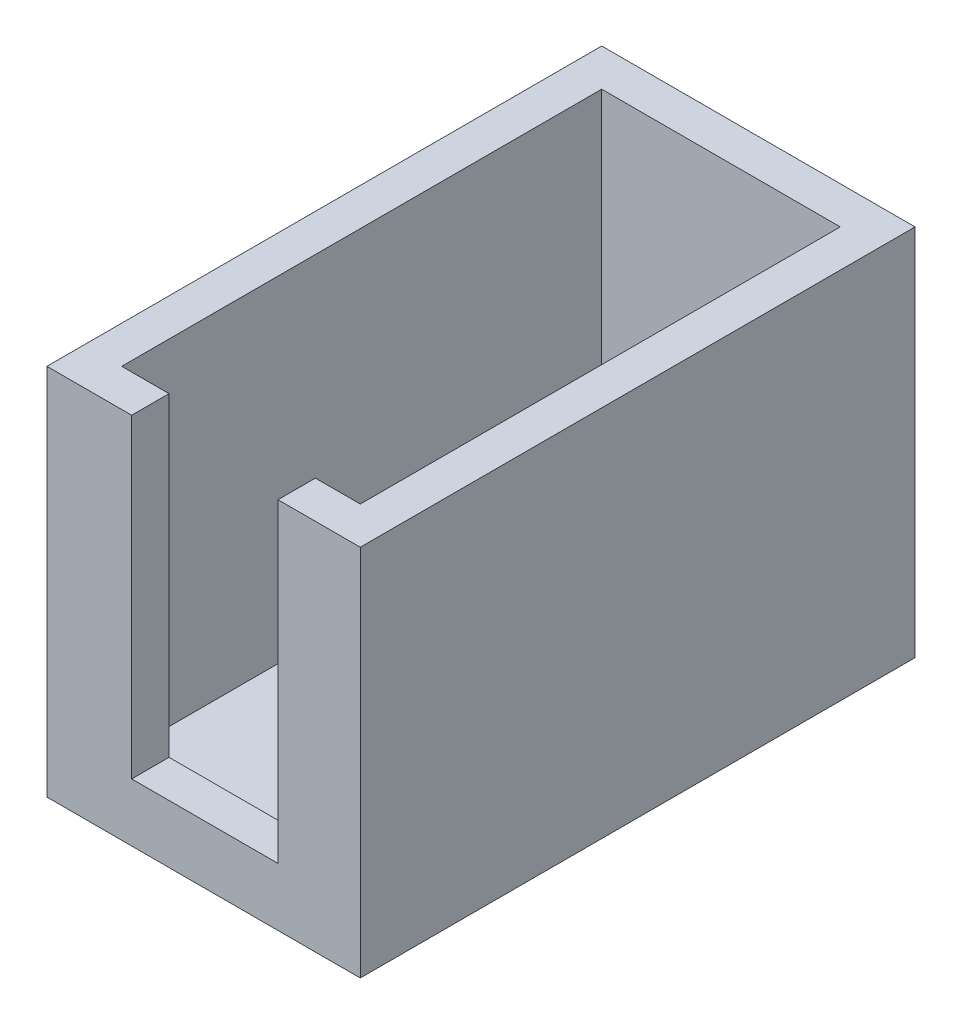
ISO-10303-21;
HEADER;
FILE_DESCRIPTION(('STEP AP214'),'2;1');
FILE_NAME('part.step','',(''),(''),'','','');
FILE_SCHEMA(('AUTOMOTIVE_DESIGN { 1 0 10303 214 1 1 1 1 }'));
ENDSEC;
DATA;
#1=APPLICATION_CONTEXT('core data for automotive mechanical design processes');
#2=APPLICATION_PROTOCOL_DEFINITION('international standard','automotive_design',2000,#1);
#3=PRODUCT_CONTEXT('',#1,'mechanical');
#4=PRODUCT('Part','Part','',(#3));
#5=PRODUCT_RELATED_PRODUCT_CATEGORY('part','',(#4));
#6=PRODUCT_DEFINITION_FORMATION('','',#4);
#7=PRODUCT_DEFINITION_CONTEXT('part definition',#1,'design');
#8=PRODUCT_DEFINITION('design','',#6,#7);
#9=PRODUCT_DEFINITION_SHAPE('','',#8);
#10=(LENGTH_UNIT() NAMED_UNIT(*) SI_UNIT(.MILLI.,.METRE.));
#11=(NAMED_UNIT(*) PLANE_ANGLE_UNIT() SI_UNIT($,.RADIAN.));
#12=(NAMED_UNIT(*) SI_UNIT($,.STERADIAN.) SOLID_ANGLE_UNIT());
#13=UNCERTAINTY_MEASURE_WITH_UNIT(LENGTH_MEASURE(1.E-05),#10,'distance_accuracy_value','');
#14=(GEOMETRIC_REPRESENTATION_CONTEXT(3) GLOBAL_UNCERTAINTY_ASSIGNED_CONTEXT((#13)) GLOBAL_UNIT_ASSIGNED_CONTEXT((#10,
#11,#12)) REPRESENTATION_CONTEXT('',''));
#15=CARTESIAN_POINT('',(0.,0.,0.));
#16=DIRECTION('',(0.,0.,1.));
#17=DIRECTION('',(1.,0.,0.));
#18=AXIS2_PLACEMENT_3D('',#15,#16,#17);
#19=CARTESIAN_POINT('',(0.,28.5,0.));
#20=DIRECTION('',(0.,-1.,0.));
#21=DIRECTION('',(0.,0.,-1.));
#22=AXIS2_PLACEMENT_3D('',#19,#20,#21);
#23=PLANE('',#22);
#24=DIRECTION('',(1.,0.,0.));
#25=VECTOR('',#24,1.);
#26=CARTESIAN_POINT('',(-10.127,28.5,20.377));
#27=LINE('',#26,#25);
#28=CARTESIAN_POINT('',(6.31565311853081,28.5,20.377));
#29=VERTEX_POINT('',#28);
#30=CARTESIAN_POINT('',(10.127,28.5,20.377));
#31=VERTEX_POINT('',#30);
#32=EDGE_CURVE('E187',#29,#31,#27,.T.);
#33=ORIENTED_EDGE('',*,*,#32,.F.);
#34=DIRECTION('',(0.,0.,1.));
#35=VECTOR('',#34,1.);
#36=CARTESIAN_POINT('',(6.31565311853081,28.5,-9.10991074063502));
#37=LINE('',#36,#35);
#38=CARTESIAN_POINT('',(6.31565311853081,28.5,23.552));
#39=VERTEX_POINT('',#38);
#40=EDGE_CURVE('E142',#29,#39,#37,.T.);
#41=ORIENTED_EDGE('',*,*,#40,.T.);
#42=DIRECTION('',(1.,0.,0.));
#43=VECTOR('',#42,1.);
#44=CARTESIAN_POINT('',(0.,28.5,23.552));
#45=LINE('',#44,#43);
#46=CARTESIAN_POINT('',(13.302,28.5,23.552));
#47=VERTEX_POINT('',#46);
#48=EDGE_CURVE('E248',#39,#47,#45,.T.);
#49=ORIENTED_EDGE('',*,*,#48,.T.);
#50=DIRECTION('',(0.,0.,-1.));
#51=VECTOR('',#50,1.);
#52=CARTESIAN_POINT('',(13.302,28.5,0.));
#53=LINE('',#52,#51);
#54=CARTESIAN_POINT('',(13.302,28.5,-23.552));
#55=VERTEX_POINT('',#54);
#56=EDGE_CURVE('E240',#47,#55,#53,.T.);
#57=ORIENTED_EDGE('',*,*,#56,.T.);
#58=DIRECTION('',(-1.,0.,0.));
#59=VECTOR('',#58,1.);
#60=CARTESIAN_POINT('',(0.,28.5,-23.552));
#61=LINE('',#60,#59);
#62=CARTESIAN_POINT('',(-13.302,28.5,-23.552));
#63=VERTEX_POINT('',#62);
#64=EDGE_CURVE('E244',#55,#63,#61,.T.);
#65=ORIENTED_EDGE('',*,*,#64,.T.);
#66=DIRECTION('',(0.,0.,1.));
#67=VECTOR('',#66,1.);
#68=CARTESIAN_POINT('',(-13.302,28.5,0.));
#69=LINE('',#68,#67);
#70=CARTESIAN_POINT('',(-13.302,28.5,23.552));
#71=VERTEX_POINT('',#70);
#72=EDGE_CURVE('E246',#63,#71,#69,.T.);
#73=ORIENTED_EDGE('',*,*,#72,.T.);
#74=CARTESIAN_POINT('',(-6.10790137121073,28.5,23.552));
#75=VERTEX_POINT('',#74);
#76=EDGE_CURVE('E47',#71,#75,#45,.T.);
#77=ORIENTED_EDGE('',*,*,#76,.T.);
#78=DIRECTION('',(0.,0.,1.));
#79=VECTOR('',#78,1.);
#80=CARTESIAN_POINT('',(-6.10790137121073,28.5,-9.10991074063502));
#81=LINE('',#80,#79);
#82=CARTESIAN_POINT('',(-6.10790137121073,28.5,20.377));
#83=VERTEX_POINT('',#82);
#84=EDGE_CURVE('E168',#83,#75,#81,.T.);
#85=ORIENTED_EDGE('',*,*,#84,.F.);
#86=CARTESIAN_POINT('',(-10.127,28.5,20.377));
#87=VERTEX_POINT('',#86);
#88=EDGE_CURVE('E188',#87,#83,#27,.T.);
#89=ORIENTED_EDGE('',*,*,#88,.F.);
#90=DIRECTION('',(0.,0.,1.));
#91=VECTOR('',#90,1.);
#92=CARTESIAN_POINT('',(-10.127,28.5,20.377));
#93=LINE('',#92,#91);
#94=CARTESIAN_POINT('',(-10.127,28.5,-20.377));
#95=VERTEX_POINT('',#94);
#96=EDGE_CURVE('E184',#95,#87,#93,.T.);
#97=ORIENTED_EDGE('',*,*,#96,.F.);
#98=DIRECTION('',(-1.,0.,0.));
#99=VECTOR('',#98,1.);
#100=CARTESIAN_POINT('',(-10.127,28.5,-20.377));
#101=LINE('',#100,#99);
#102=CARTESIAN_POINT('',(10.127,28.5,-20.377));
#103=VERTEX_POINT('',#102);
#104=EDGE_CURVE('E180',#103,#95,#101,.T.);
#105=ORIENTED_EDGE('',*,*,#104,.F.);
#106=DIRECTION('',(0.,0.,-1.));
#107=VECTOR('',#106,1.);
#108=CARTESIAN_POINT('',(10.127,28.5,20.377));
#109=LINE('',#108,#107);
#110=EDGE_CURVE('E177',#31,#103,#109,.T.);
#111=ORIENTED_EDGE('',*,*,#110,.F.);
#112=EDGE_LOOP('',(#33,#41,#49,#57,#65,#73,#77,#85,#89,#97,#105,#111));
#113=FACE_BOUND('',#112,.T.);
#114=ADVANCED_FACE('F43',(#113),#23,.F.);
#115=CARTESIAN_POINT('',(13.302,28.5,20.377));
#116=DIRECTION('',(-1.,0.,0.));
#117=DIRECTION('',(0.,0.,1.));
#118=AXIS2_PLACEMENT_3D('',#115,#116,#117);
#119=PLANE('',#118);
#120=DIRECTION('',(0.,0.,-1.));
#121=VECTOR('',#120,1.);
#122=CARTESIAN_POINT('',(13.302,-3.175,0.));
#123=LINE('',#122,#121);
#124=CARTESIAN_POINT('',(13.302,-3.175,23.552));
#125=VERTEX_POINT('',#124);
#126=CARTESIAN_POINT('',(13.302,-3.175,-23.552));
#127=VERTEX_POINT('',#126);
#128=EDGE_CURVE('E216',#125,#127,#123,.T.);
#129=ORIENTED_EDGE('',*,*,#128,.T.);
#130=DIRECTION('',(0.,-1.,0.));
#131=VECTOR('',#130,1.);
#132=CARTESIAN_POINT('',(13.302,28.5,-23.552));
#133=LINE('',#132,#131);
#134=EDGE_CURVE('E11',#55,#127,#133,.T.);
#135=ORIENTED_EDGE('',*,*,#134,.F.);
#136=ORIENTED_EDGE('',*,*,#56,.F.);
#137=DIRECTION('',(0.,-1.,0.));
#138=VECTOR('',#137,1.);
#139=CARTESIAN_POINT('',(13.302,28.5,23.552));
#140=LINE('',#139,#138);
#141=EDGE_CURVE('E221',#47,#125,#140,.T.);
#142=ORIENTED_EDGE('',*,*,#141,.T.);
#143=EDGE_LOOP('',(#129,#135,#136,#142));
#144=FACE_BOUND('',#143,.T.);
#145=ADVANCED_FACE('F274',(#144),#119,.F.);
#146=CARTESIAN_POINT('',(-10.127,28.5,-23.552));
#147=DIRECTION('',(0.,0.,1.));
#148=DIRECTION('',(1.,0.,0.));
#149=AXIS2_PLACEMENT_3D('',#146,#147,#148);
#150=PLANE('',#149);
#151=DIRECTION('',(-1.,0.,0.));
#152=VECTOR('',#151,1.);
#153=CARTESIAN_POINT('',(0.,-3.175,-23.552));
#154=LINE('',#153,#152);
#155=CARTESIAN_POINT('',(-13.302,-3.175,-23.552));
#156=VERTEX_POINT('',#155);
#157=EDGE_CURVE('E219',#127,#156,#154,.T.);
#158=ORIENTED_EDGE('',*,*,#157,.T.);
#159=DIRECTION('',(0.,-1.,0.));
#160=VECTOR('',#159,1.);
#161=CARTESIAN_POINT('',(-13.302,28.5,-23.552));
#162=LINE('',#161,#160);
#163=EDGE_CURVE('E53',#63,#156,#162,.T.);
#164=ORIENTED_EDGE('',*,*,#163,.F.);
#165=ORIENTED_EDGE('',*,*,#64,.F.);
#166=ORIENTED_EDGE('',*,*,#134,.T.);
#167=EDGE_LOOP('',(#158,#164,#165,#166));
#168=FACE_BOUND('',#167,.T.);
#169=ADVANCED_FACE('F279',(#168),#150,.F.);
#170=CARTESIAN_POINT('',(-13.302,28.5,20.377));
#171=DIRECTION('',(1.,0.,0.));
#172=DIRECTION('',(0.,0.,-1.));
#173=AXIS2_PLACEMENT_3D('',#170,#171,#172);
#174=PLANE('',#173);
#175=DIRECTION('',(0.,0.,1.));
#176=VECTOR('',#175,1.);
#177=CARTESIAN_POINT('',(-13.302,-3.175,0.));
#178=LINE('',#177,#176);
#179=CARTESIAN_POINT('',(-13.302,-3.175,23.552));
#180=VERTEX_POINT('',#179);
#181=EDGE_CURVE('E228',#156,#180,#178,.T.);
#182=ORIENTED_EDGE('',*,*,#181,.T.);
#183=DIRECTION('',(0.,-1.,0.));
#184=VECTOR('',#183,1.);
#185=CARTESIAN_POINT('',(-13.302,28.5,23.552));
#186=LINE('',#185,#184);
#187=EDGE_CURVE('E225',#71,#180,#186,.T.);
#188=ORIENTED_EDGE('',*,*,#187,.F.);
#189=ORIENTED_EDGE('',*,*,#72,.F.);
#190=ORIENTED_EDGE('',*,*,#163,.T.);
#191=EDGE_LOOP('',(#182,#188,#189,#190));
#192=FACE_BOUND('',#191,.T.);
#193=ADVANCED_FACE('F288',(#192),#174,.F.);
#194=CARTESIAN_POINT('',(-10.127,28.5,23.552));
#195=DIRECTION('',(0.,0.,-1.));
#196=DIRECTION('',(-1.,0.,0.));
#197=AXIS2_PLACEMENT_3D('',#194,#195,#196);
#198=PLANE('',#197);
#199=ORIENTED_EDGE('',*,*,#48,.F.);
#200=DIRECTION('',(0.,1.,0.));
#201=VECTOR('',#200,1.);
#202=CARTESIAN_POINT('',(6.31565311853081,28.5,23.552));
#203=LINE('',#202,#201);
#204=CARTESIAN_POINT('',(6.31565311853081,1.75802552415773,23.552));
#205=VERTEX_POINT('',#204);
#206=EDGE_CURVE('E159',#205,#39,#203,.T.);
#207=ORIENTED_EDGE('',*,*,#206,.F.);
#208=DIRECTION('',(1.,0.,0.));
#209=VECTOR('',#208,1.);
#210=CARTESIAN_POINT('',(-6.10790137121073,1.75802552415773,23.552));
#211=LINE('',#210,#209);
#212=CARTESIAN_POINT('',(-6.10790137121073,1.75802552415773,23.552));
#213=VERTEX_POINT('',#212);
#214=EDGE_CURVE('E152',#213,#205,#211,.T.);
#215=ORIENTED_EDGE('',*,*,#214,.F.);
#216=DIRECTION('',(0.,-1.,0.));
#217=VECTOR('',#216,1.);
#218=CARTESIAN_POINT('',(-6.10790137121073,28.5,23.552));
#219=LINE('',#218,#217);
#220=EDGE_CURVE('E165',#75,#213,#219,.T.);
#221=ORIENTED_EDGE('',*,*,#220,.F.);
#222=ORIENTED_EDGE('',*,*,#76,.F.);
#223=ORIENTED_EDGE('',*,*,#187,.T.);
#224=DIRECTION('',(1.,0.,0.));
#225=VECTOR('',#224,1.);
#226=CARTESIAN_POINT('',(0.,-3.175,23.552));
#227=LINE('',#226,#225);
#228=EDGE_CURVE('E234',#180,#125,#227,.T.);
#229=ORIENTED_EDGE('',*,*,#228,.T.);
#230=ORIENTED_EDGE('',*,*,#141,.F.);
#231=EDGE_LOOP('',(#199,#207,#215,#221,#222,#223,#229,#230));
#232=FACE_BOUND('',#231,.T.);
#233=ADVANCED_FACE('F262',(#232),#198,.F.);
#234=CARTESIAN_POINT('',(0.,-3.175,0.));
#235=DIRECTION('',(0.,-1.,0.));
#236=DIRECTION('',(0.,0.,-1.));
#237=AXIS2_PLACEMENT_3D('',#234,#235,#236);
#238=PLANE('',#237);
#239=ORIENTED_EDGE('',*,*,#128,.F.);
#240=ORIENTED_EDGE('',*,*,#228,.F.);
#241=ORIENTED_EDGE('',*,*,#181,.F.);
#242=ORIENTED_EDGE('',*,*,#157,.F.);
#243=EDGE_LOOP('',(#239,#240,#241,#242));
#244=FACE_BOUND('',#243,.T.);
#245=ADVANCED_FACE('F45',(#244),#238,.T.);
#246=CARTESIAN_POINT('',(10.127,28.5,20.377));
#247=DIRECTION('',(-1.,0.,0.));
#248=DIRECTION('',(0.,0.,1.));
#249=AXIS2_PLACEMENT_3D('',#246,#247,#248);
#250=PLANE('',#249);
#251=DIRECTION('',(0.,0.,-1.));
#252=VECTOR('',#251,1.);
#253=CARTESIAN_POINT('',(10.127,0.,20.377));
#254=LINE('',#253,#252);
#255=CARTESIAN_POINT('',(10.127,0.,20.377));
#256=VERTEX_POINT('',#255);
#257=CARTESIAN_POINT('',(10.127,0.,-20.377));
#258=VERTEX_POINT('',#257);
#259=EDGE_CURVE('E176',#256,#258,#254,.T.);
#260=ORIENTED_EDGE('',*,*,#259,.F.);
#261=DIRECTION('',(0.,-1.,0.));
#262=VECTOR('',#261,1.);
#263=CARTESIAN_POINT('',(10.127,28.5,20.377));
#264=LINE('',#263,#262);
#265=EDGE_CURVE('E191',#31,#256,#264,.T.);
#266=ORIENTED_EDGE('',*,*,#265,.F.);
#267=ORIENTED_EDGE('',*,*,#110,.T.);
#268=DIRECTION('',(0.,-1.,0.));
#269=VECTOR('',#268,1.);
#270=CARTESIAN_POINT('',(10.127,28.5,-20.377));
#271=LINE('',#270,#269);
#272=EDGE_CURVE('E212',#103,#258,#271,.T.);
#273=ORIENTED_EDGE('',*,*,#272,.T.);
#274=EDGE_LOOP('',(#260,#266,#267,#273));
#275=FACE_BOUND('',#274,.T.);
#276=ADVANCED_FACE('F283',(#275),#250,.T.);
#277=CARTESIAN_POINT('',(-10.127,28.5,-20.377));
#278=DIRECTION('',(0.,0.,1.));
#279=DIRECTION('',(1.,0.,0.));
#280=AXIS2_PLACEMENT_3D('',#277,#278,#279);
#281=PLANE('',#280);
#282=DIRECTION('',(-1.,0.,0.));
#283=VECTOR('',#282,1.);
#284=CARTESIAN_POINT('',(-10.127,0.,-20.377));
#285=LINE('',#284,#283);
#286=CARTESIAN_POINT('',(-10.127,0.,-20.377));
#287=VERTEX_POINT('',#286);
#288=EDGE_CURVE('E195',#258,#287,#285,.T.);
#289=ORIENTED_EDGE('',*,*,#288,.F.);
#290=ORIENTED_EDGE('',*,*,#272,.F.);
#291=ORIENTED_EDGE('',*,*,#104,.T.);
#292=DIRECTION('',(0.,-1.,0.));
#293=VECTOR('',#292,1.);
#294=CARTESIAN_POINT('',(-10.127,28.5,-20.377));
#295=LINE('',#294,#293);
#296=EDGE_CURVE('E208',#95,#287,#295,.T.);
#297=ORIENTED_EDGE('',*,*,#296,.T.);
#298=EDGE_LOOP('',(#289,#290,#291,#297));
#299=FACE_BOUND('',#298,.T.);
#300=ADVANCED_FACE('F300',(#299),#281,.T.);
#301=CARTESIAN_POINT('',(-10.127,28.5,20.377));
#302=DIRECTION('',(1.,0.,0.));
#303=DIRECTION('',(0.,0.,-1.));
#304=AXIS2_PLACEMENT_3D('',#301,#302,#303);
#305=PLANE('',#304);
#306=DIRECTION('',(0.,0.,1.));
#307=VECTOR('',#306,1.);
#308=CARTESIAN_POINT('',(-10.127,0.,20.377));
#309=LINE('',#308,#307);
#310=CARTESIAN_POINT('',(-10.127,0.,20.377));
#311=VERTEX_POINT('',#310);
#312=EDGE_CURVE('E198',#287,#311,#309,.T.);
#313=ORIENTED_EDGE('',*,*,#312,.F.);
#314=ORIENTED_EDGE('',*,*,#296,.F.);
#315=ORIENTED_EDGE('',*,*,#96,.T.);
#316=DIRECTION('',(0.,-1.,0.));
#317=VECTOR('',#316,1.);
#318=CARTESIAN_POINT('',(-10.127,28.5,20.377));
#319=LINE('',#318,#317);
#320=EDGE_CURVE('E69',#87,#311,#319,.T.);
#321=ORIENTED_EDGE('',*,*,#320,.T.);
#322=EDGE_LOOP('',(#313,#314,#315,#321));
#323=FACE_BOUND('',#322,.T.);
#324=ADVANCED_FACE('F317',(#323),#305,.T.);
#325=CARTESIAN_POINT('',(-10.127,28.5,20.377));
#326=DIRECTION('',(0.,0.,-1.));
#327=DIRECTION('',(-1.,0.,0.));
#328=AXIS2_PLACEMENT_3D('',#325,#326,#327);
#329=PLANE('',#328);
#330=DIRECTION('',(0.,1.,0.));
#331=VECTOR('',#330,1.);
#332=CARTESIAN_POINT('',(6.31565311853081,28.5,20.377));
#333=LINE('',#332,#331);
#334=CARTESIAN_POINT('',(6.31565311853081,1.75802552415773,20.377));
#335=VERTEX_POINT('',#334);
#336=EDGE_CURVE('E136',#335,#29,#333,.T.);
#337=ORIENTED_EDGE('',*,*,#336,.T.);
#338=ORIENTED_EDGE('',*,*,#32,.T.);
#339=ORIENTED_EDGE('',*,*,#265,.T.);
#340=DIRECTION('',(1.,0.,0.));
#341=VECTOR('',#340,1.);
#342=CARTESIAN_POINT('',(-10.127,0.,20.377));
#343=LINE('',#342,#341);
#344=EDGE_CURVE('E181',#311,#256,#343,.T.);
#345=ORIENTED_EDGE('',*,*,#344,.F.);
#346=ORIENTED_EDGE('',*,*,#320,.F.);
#347=ORIENTED_EDGE('',*,*,#88,.T.);
#348=DIRECTION('',(0.,-1.,0.));
#349=VECTOR('',#348,1.);
#350=CARTESIAN_POINT('',(-6.10790137121073,28.5,20.377));
#351=LINE('',#350,#349);
#352=CARTESIAN_POINT('',(-6.10790137121073,1.75802552415773,20.377));
#353=VERTEX_POINT('',#352);
#354=EDGE_CURVE('E157',#83,#353,#351,.T.);
#355=ORIENTED_EDGE('',*,*,#354,.T.);
#356=DIRECTION('',(1.,0.,0.));
#357=VECTOR('',#356,1.);
#358=CARTESIAN_POINT('',(-6.10790137121073,1.75802552415773,20.377));
#359=LINE('',#358,#357);
#360=EDGE_CURVE('E149',#353,#335,#359,.T.);
#361=ORIENTED_EDGE('',*,*,#360,.T.);
#362=EDGE_LOOP('',(#337,#338,#339,#345,#346,#347,#355,#361));
#363=FACE_BOUND('',#362,.T.);
#364=ADVANCED_FACE('F156',(#363),#329,.T.);
#365=CARTESIAN_POINT('',(0.,0.,0.));
#366=DIRECTION('',(0.,-1.,0.));
#367=DIRECTION('',(0.,0.,-1.));
#368=AXIS2_PLACEMENT_3D('',#365,#366,#367);
#369=PLANE('',#368);
#370=ORIENTED_EDGE('',*,*,#259,.T.);
#371=ORIENTED_EDGE('',*,*,#288,.T.);
#372=ORIENTED_EDGE('',*,*,#312,.T.);
#373=ORIENTED_EDGE('',*,*,#344,.T.);
#374=EDGE_LOOP('',(#370,#371,#372,#373));
#375=FACE_BOUND('',#374,.T.);
#376=ADVANCED_FACE('F313',(#375),#369,.F.);
#377=CARTESIAN_POINT('',(-6.10790137121073,1.75802552415773,-9.10991074063502));
#378=DIRECTION('',(0.,-1.,0.));
#379=DIRECTION('',(0.,0.,-1.));
#380=AXIS2_PLACEMENT_3D('',#377,#378,#379);
#381=PLANE('',#380);
#382=DIRECTION('',(0.,0.,1.));
#383=VECTOR('',#382,1.);
#384=CARTESIAN_POINT('',(-6.10790137121073,1.75802552415773,-9.10991074063502));
#385=LINE('',#384,#383);
#386=EDGE_CURVE('E61',#353,#213,#385,.T.);
#387=ORIENTED_EDGE('',*,*,#386,.T.);
#388=ORIENTED_EDGE('',*,*,#214,.T.);
#389=DIRECTION('',(0.,0.,1.));
#390=VECTOR('',#389,1.);
#391=CARTESIAN_POINT('',(6.31565311853081,1.75802552415773,-9.10991074063502));
#392=LINE('',#391,#390);
#393=EDGE_CURVE('E139',#335,#205,#392,.T.);
#394=ORIENTED_EDGE('',*,*,#393,.F.);
#395=ORIENTED_EDGE('',*,*,#360,.F.);
#396=EDGE_LOOP('',(#387,#388,#394,#395));
#397=FACE_BOUND('',#396,.T.);
#398=ADVANCED_FACE('F148',(#397),#381,.F.);
#399=CARTESIAN_POINT('',(6.31565311853081,28.5,-9.10991074063502));
#400=DIRECTION('',(1.,0.,0.));
#401=DIRECTION('',(0.,0.,-1.));
#402=AXIS2_PLACEMENT_3D('',#399,#400,#401);
#403=PLANE('',#402);
#404=ORIENTED_EDGE('',*,*,#393,.T.);
#405=ORIENTED_EDGE('',*,*,#206,.T.);
#406=ORIENTED_EDGE('',*,*,#40,.F.);
#407=ORIENTED_EDGE('',*,*,#336,.F.);
#408=EDGE_LOOP('',(#404,#405,#406,#407));
#409=FACE_BOUND('',#408,.T.);
#410=ADVANCED_FACE('F138',(#409),#403,.F.);
#411=CARTESIAN_POINT('',(-6.10790137121073,28.5,-9.10991074063502));
#412=DIRECTION('',(-1.,0.,0.));
#413=DIRECTION('',(0.,0.,1.));
#414=AXIS2_PLACEMENT_3D('',#411,#412,#413);
#415=PLANE('',#414);
#416=ORIENTED_EDGE('',*,*,#84,.T.);
#417=ORIENTED_EDGE('',*,*,#220,.T.);
#418=ORIENTED_EDGE('',*,*,#386,.F.);
#419=ORIENTED_EDGE('',*,*,#354,.F.);
#420=EDGE_LOOP('',(#416,#417,#418,#419));
#421=FACE_BOUND('',#420,.T.);
#422=ADVANCED_FACE('F266',(#421),#415,.F.);
#423=CLOSED_SHELL('',(#114,#145,#169,#193,#233,#245,#276,#300,#324,#364,#376,#398,#410,#422));
#424=MANIFOLD_SOLID_BREP('B2',#423);
#425=ADVANCED_BREP_SHAPE_REPRESENTATION('',(#18,#424),#14);
#426=SHAPE_DEFINITION_REPRESENTATION(#9,#425);
ENDSEC;
END-ISO-10303-21;
